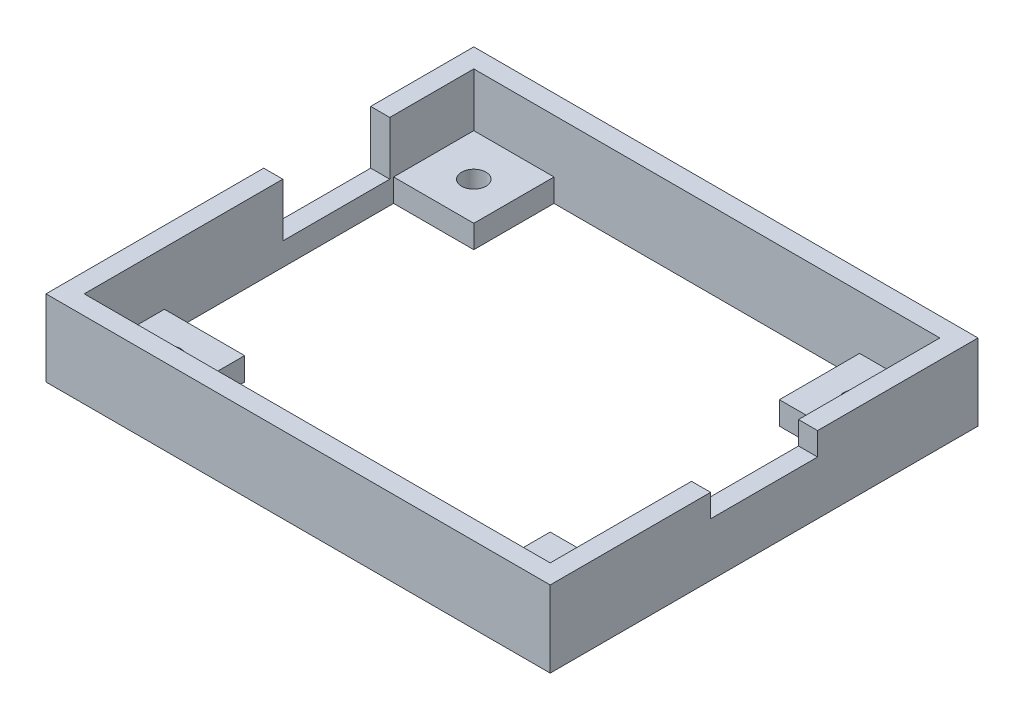
ISO-10303-21;
HEADER;
FILE_DESCRIPTION(('STEP AP214'),'2;1');
FILE_NAME('part.step','',(''),(''),'','','');
FILE_SCHEMA(('AUTOMOTIVE_DESIGN { 1 0 10303 214 1 1 1 1 }'));
ENDSEC;
DATA;
#1=APPLICATION_CONTEXT('core data for automotive mechanical design processes');
#2=APPLICATION_PROTOCOL_DEFINITION('international standard','automotive_design',2000,#1);
#3=PRODUCT_CONTEXT('',#1,'mechanical');
#4=PRODUCT('Part','Part','',(#3));
#5=PRODUCT_RELATED_PRODUCT_CATEGORY('part','',(#4));
#6=PRODUCT_DEFINITION_FORMATION('','',#4);
#7=PRODUCT_DEFINITION_CONTEXT('part definition',#1,'design');
#8=PRODUCT_DEFINITION('design','',#6,#7);
#9=PRODUCT_DEFINITION_SHAPE('','',#8);
#10=(LENGTH_UNIT() NAMED_UNIT(*) SI_UNIT(.MILLI.,.METRE.));
#11=(NAMED_UNIT(*) PLANE_ANGLE_UNIT() SI_UNIT($,.RADIAN.));
#12=(NAMED_UNIT(*) SI_UNIT($,.STERADIAN.) SOLID_ANGLE_UNIT());
#13=UNCERTAINTY_MEASURE_WITH_UNIT(LENGTH_MEASURE(1.E-05),#10,'distance_accuracy_value','');
#14=(GEOMETRIC_REPRESENTATION_CONTEXT(3) GLOBAL_UNCERTAINTY_ASSIGNED_CONTEXT((#13)) GLOBAL_UNIT_ASSIGNED_CONTEXT((#10,
#11,#12)) REPRESENTATION_CONTEXT('',''));
#15=CARTESIAN_POINT('',(0.,0.,0.));
#16=DIRECTION('',(0.,0.,1.));
#17=DIRECTION('',(1.,0.,0.));
#18=AXIS2_PLACEMENT_3D('',#15,#16,#17);
#19=CARTESIAN_POINT('',(0.,10.,0.));
#20=DIRECTION('',(0.,1.,0.));
#21=DIRECTION('',(0.,0.,1.));
#22=AXIS2_PLACEMENT_3D('',#19,#20,#21);
#23=PLANE('',#22);
#24=DIRECTION('',(1.,0.,0.));
#25=VECTOR('',#24,1.);
#26=CARTESIAN_POINT('',(23.,10.,7.));
#27=LINE('',#26,#25);
#28=CARTESIAN_POINT('',(30.5,10.,7.));
#29=VERTEX_POINT('',#28);
#30=CARTESIAN_POINT('',(33.,10.,7.));
#31=VERTEX_POINT('',#30);
#32=EDGE_CURVE('E234',#29,#31,#27,.T.);
#33=ORIENTED_EDGE('',*,*,#32,.F.);
#34=DIRECTION('',(0.,0.,-1.));
#35=VECTOR('',#34,1.);
#36=CARTESIAN_POINT('',(30.5,10.,25.5));
#37=LINE('',#36,#35);
#38=CARTESIAN_POINT('',(30.5,10.,25.5));
#39=VERTEX_POINT('',#38);
#40=EDGE_CURVE('E390',#39,#29,#37,.T.);
#41=ORIENTED_EDGE('',*,*,#40,.F.);
#42=DIRECTION('',(1.,0.,0.));
#43=VECTOR('',#42,1.);
#44=CARTESIAN_POINT('',(30.5,10.,25.5));
#45=LINE('',#44,#43);
#46=CARTESIAN_POINT('',(-30.5,10.,25.5));
#47=VERTEX_POINT('',#46);
#48=EDGE_CURVE('E386',#47,#39,#45,.T.);
#49=ORIENTED_EDGE('',*,*,#48,.F.);
#50=DIRECTION('',(0.,0.,1.));
#51=VECTOR('',#50,1.);
#52=CARTESIAN_POINT('',(-30.5,10.,25.5));
#53=LINE('',#52,#51);
#54=CARTESIAN_POINT('',(-30.5,10.,-0.499999999999997));
#55=VERTEX_POINT('',#54);
#56=EDGE_CURVE('E363',#55,#47,#53,.T.);
#57=ORIENTED_EDGE('',*,*,#56,.F.);
#58=DIRECTION('',(1.,0.,0.));
#59=VECTOR('',#58,1.);
#60=CARTESIAN_POINT('',(-40.5,10.,-0.499999999999997));
#61=LINE('',#60,#59);
#62=CARTESIAN_POINT('',(-33.,10.,-0.499999999999997));
#63=VERTEX_POINT('',#62);
#64=EDGE_CURVE('E259',#63,#55,#61,.T.);
#65=ORIENTED_EDGE('',*,*,#64,.F.);
#66=DIRECTION('',(0.,0.,1.));
#67=VECTOR('',#66,1.);
#68=CARTESIAN_POINT('',(-33.,10.,28.));
#69=LINE('',#68,#67);
#70=CARTESIAN_POINT('',(-33.,10.,28.));
#71=VERTEX_POINT('',#70);
#72=EDGE_CURVE('E410',#63,#71,#69,.T.);
#73=ORIENTED_EDGE('',*,*,#72,.T.);
#74=DIRECTION('',(1.,0.,0.));
#75=VECTOR('',#74,1.);
#76=CARTESIAN_POINT('',(33.,10.,28.));
#77=LINE('',#76,#75);
#78=CARTESIAN_POINT('',(33.,10.,28.));
#79=VERTEX_POINT('',#78);
#80=EDGE_CURVE('E409',#71,#79,#77,.T.);
#81=ORIENTED_EDGE('',*,*,#80,.T.);
#82=DIRECTION('',(0.,0.,-1.));
#83=VECTOR('',#82,1.);
#84=CARTESIAN_POINT('',(33.,10.,28.));
#85=LINE('',#84,#83);
#86=EDGE_CURVE('E413',#79,#31,#85,.T.);
#87=ORIENTED_EDGE('',*,*,#86,.T.);
#88=EDGE_LOOP('',(#33,#41,#49,#57,#65,#73,#81,#87));
#89=FACE_BOUND('',#88,.T.);
#90=ADVANCED_FACE('F35',(#89),#23,.T.);
#91=CARTESIAN_POINT('',(-33.,10.,28.));
#92=DIRECTION('',(1.,0.,0.));
#93=DIRECTION('',(0.,0.,-1.));
#94=AXIS2_PLACEMENT_3D('',#91,#92,#93);
#95=PLANE('',#94);
#96=DIRECTION('',(0.,1.,0.));
#97=VECTOR('',#96,1.);
#98=CARTESIAN_POINT('',(-33.,10.,-0.499999999999997));
#99=LINE('',#98,#97);
#100=CARTESIAN_POINT('',(-33.,3.,-0.499999999999997));
#101=VERTEX_POINT('',#100);
#102=EDGE_CURVE('E267',#101,#63,#99,.T.);
#103=ORIENTED_EDGE('',*,*,#102,.F.);
#104=DIRECTION('',(0.,0.,-1.));
#105=VECTOR('',#104,1.);
#106=CARTESIAN_POINT('',(-33.,3.,28.));
#107=LINE('',#106,#105);
#108=CARTESIAN_POINT('',(-33.,3.,-14.5));
#109=VERTEX_POINT('',#108);
#110=EDGE_CURVE('E269',#101,#109,#107,.T.);
#111=ORIENTED_EDGE('',*,*,#110,.T.);
#112=DIRECTION('',(0.,1.,0.));
#113=VECTOR('',#112,1.);
#114=CARTESIAN_POINT('',(-33.,10.,-14.5));
#115=LINE('',#114,#113);
#116=CARTESIAN_POINT('',(-33.,10.,-14.5));
#117=VERTEX_POINT('',#116);
#118=EDGE_CURVE('E258',#109,#117,#115,.T.);
#119=ORIENTED_EDGE('',*,*,#118,.T.);
#120=CARTESIAN_POINT('',(-33.,10.,-28.));
#121=VERTEX_POINT('',#120);
#122=EDGE_CURVE('E406',#121,#117,#69,.T.);
#123=ORIENTED_EDGE('',*,*,#122,.F.);
#124=DIRECTION('',(0.,-1.,0.));
#125=VECTOR('',#124,1.);
#126=CARTESIAN_POINT('',(-33.,10.,-28.));
#127=LINE('',#126,#125);
#128=CARTESIAN_POINT('',(-33.,0.,-28.));
#129=VERTEX_POINT('',#128);
#130=EDGE_CURVE('E417',#121,#129,#127,.T.);
#131=ORIENTED_EDGE('',*,*,#130,.T.);
#132=DIRECTION('',(0.,0.,1.));
#133=VECTOR('',#132,1.);
#134=CARTESIAN_POINT('',(-33.,0.,28.));
#135=LINE('',#134,#133);
#136=CARTESIAN_POINT('',(-33.,0.,28.));
#137=VERTEX_POINT('',#136);
#138=EDGE_CURVE('E398',#129,#137,#135,.T.);
#139=ORIENTED_EDGE('',*,*,#138,.T.);
#140=DIRECTION('',(0.,-1.,0.));
#141=VECTOR('',#140,1.);
#142=CARTESIAN_POINT('',(-33.,10.,28.));
#143=LINE('',#142,#141);
#144=EDGE_CURVE('E434',#71,#137,#143,.T.);
#145=ORIENTED_EDGE('',*,*,#144,.F.);
#146=ORIENTED_EDGE('',*,*,#72,.F.);
#147=EDGE_LOOP('',(#103,#111,#119,#123,#131,#139,#145,#146));
#148=FACE_BOUND('',#147,.T.);
#149=ADVANCED_FACE('F512',(#148),#95,.F.);
#150=DIRECTION('',(1.,0.,0.));
#151=VECTOR('',#150,1.);
#152=CARTESIAN_POINT('',(23.,10.,-7.));
#153=LINE('',#152,#151);
#154=CARTESIAN_POINT('',(30.5,10.,-7.));
#155=VERTEX_POINT('',#154);
#156=CARTESIAN_POINT('',(33.,10.,-7.));
#157=VERTEX_POINT('',#156);
#158=EDGE_CURVE('E245',#155,#157,#153,.T.);
#159=ORIENTED_EDGE('',*,*,#158,.T.);
#160=CARTESIAN_POINT('',(33.,10.,-28.));
#161=VERTEX_POINT('',#160);
#162=EDGE_CURVE('E412',#157,#161,#85,.T.);
#163=ORIENTED_EDGE('',*,*,#162,.T.);
#164=DIRECTION('',(-1.,0.,0.));
#165=VECTOR('',#164,1.);
#166=CARTESIAN_POINT('',(33.,10.,-28.));
#167=LINE('',#166,#165);
#168=EDGE_CURVE('E415',#161,#121,#167,.T.);
#169=ORIENTED_EDGE('',*,*,#168,.T.);
#170=ORIENTED_EDGE('',*,*,#122,.T.);
#171=DIRECTION('',(1.,0.,0.));
#172=VECTOR('',#171,1.);
#173=CARTESIAN_POINT('',(-40.5,10.,-14.5));
#174=LINE('',#173,#172);
#175=CARTESIAN_POINT('',(-30.5,10.,-14.5));
#176=VERTEX_POINT('',#175);
#177=EDGE_CURVE('E261',#117,#176,#174,.T.);
#178=ORIENTED_EDGE('',*,*,#177,.T.);
#179=CARTESIAN_POINT('',(-30.5,10.,-25.5));
#180=VERTEX_POINT('',#179);
#181=EDGE_CURVE('E383',#180,#176,#53,.T.);
#182=ORIENTED_EDGE('',*,*,#181,.F.);
#183=DIRECTION('',(-1.,0.,0.));
#184=VECTOR('',#183,1.);
#185=CARTESIAN_POINT('',(30.5,10.,-25.5));
#186=LINE('',#185,#184);
#187=CARTESIAN_POINT('',(30.5,10.,-25.5));
#188=VERTEX_POINT('',#187);
#189=EDGE_CURVE('E393',#188,#180,#186,.T.);
#190=ORIENTED_EDGE('',*,*,#189,.F.);
#191=EDGE_CURVE('E389',#155,#188,#37,.T.);
#192=ORIENTED_EDGE('',*,*,#191,.F.);
#193=EDGE_LOOP('',(#159,#163,#169,#170,#178,#182,#190,#192));
#194=FACE_BOUND('',#193,.T.);
#195=ADVANCED_FACE('F457',(#194),#23,.T.);
#196=CARTESIAN_POINT('',(-30.5,3.,25.5));
#197=DIRECTION('',(-1.,0.,0.));
#198=DIRECTION('',(0.,0.,1.));
#199=AXIS2_PLACEMENT_3D('',#196,#197,#198);
#200=PLANE('',#199);
#201=DIRECTION('',(0.,1.,0.));
#202=VECTOR('',#201,1.);
#203=CARTESIAN_POINT('',(-30.5,3.,-0.499999999999997));
#204=LINE('',#203,#202);
#205=CARTESIAN_POINT('',(-30.5,3.,-0.499999999999997));
#206=VERTEX_POINT('',#205);
#207=EDGE_CURVE('E252',#206,#55,#204,.T.);
#208=ORIENTED_EDGE('',*,*,#207,.T.);
#209=ORIENTED_EDGE('',*,*,#56,.T.);
#210=DIRECTION('',(0.,1.,0.));
#211=VECTOR('',#210,1.);
#212=CARTESIAN_POINT('',(-30.5,3.,25.5));
#213=LINE('',#212,#211);
#214=CARTESIAN_POINT('',(-30.5,3.,25.5));
#215=VERTEX_POINT('',#214);
#216=EDGE_CURVE('E382',#215,#47,#213,.T.);
#217=ORIENTED_EDGE('',*,*,#216,.F.);
#218=DIRECTION('',(0.,0.,1.));
#219=VECTOR('',#218,1.);
#220=CARTESIAN_POINT('',(-30.5,3.,25.5));
#221=LINE('',#220,#219);
#222=CARTESIAN_POINT('',(-30.5,3.,15.));
#223=VERTEX_POINT('',#222);
#224=EDGE_CURVE('E370',#223,#215,#221,.T.);
#225=ORIENTED_EDGE('',*,*,#224,.F.);
#226=DIRECTION('',(0.,1.,0.));
#227=VECTOR('',#226,1.);
#228=CARTESIAN_POINT('',(-30.5,0.,15.));
#229=LINE('',#228,#227);
#230=CARTESIAN_POINT('',(-30.5,0.,15.));
#231=VERTEX_POINT('',#230);
#232=EDGE_CURVE('E348',#231,#223,#229,.T.);
#233=ORIENTED_EDGE('',*,*,#232,.F.);
#234=DIRECTION('',(0.,0.,1.));
#235=VECTOR('',#234,1.);
#236=CARTESIAN_POINT('',(-30.5,0.,0.));
#237=LINE('',#236,#235);
#238=CARTESIAN_POINT('',(-30.5,0.,-15.));
#239=VERTEX_POINT('',#238);
#240=EDGE_CURVE('E279',#239,#231,#237,.T.);
#241=ORIENTED_EDGE('',*,*,#240,.F.);
#242=DIRECTION('',(0.,1.,0.));
#243=VECTOR('',#242,1.);
#244=CARTESIAN_POINT('',(-30.5,0.,-15.));
#245=LINE('',#244,#243);
#246=CARTESIAN_POINT('',(-30.5,3.,-15.));
#247=VERTEX_POINT('',#246);
#248=EDGE_CURVE('E350',#239,#247,#245,.T.);
#249=ORIENTED_EDGE('',*,*,#248,.T.);
#250=CARTESIAN_POINT('',(-30.5,3.,-25.5));
#251=VERTEX_POINT('',#250);
#252=EDGE_CURVE('E366',#251,#247,#221,.T.);
#253=ORIENTED_EDGE('',*,*,#252,.F.);
#254=DIRECTION('',(0.,1.,0.));
#255=VECTOR('',#254,1.);
#256=CARTESIAN_POINT('',(-30.5,3.,-25.5));
#257=LINE('',#256,#255);
#258=EDGE_CURVE('E396',#251,#180,#257,.T.);
#259=ORIENTED_EDGE('',*,*,#258,.T.);
#260=ORIENTED_EDGE('',*,*,#181,.T.);
#261=DIRECTION('',(0.,1.,0.));
#262=VECTOR('',#261,1.);
#263=CARTESIAN_POINT('',(-30.5,3.,-14.5));
#264=LINE('',#263,#262);
#265=CARTESIAN_POINT('',(-30.5,3.,-14.5));
#266=VERTEX_POINT('',#265);
#267=EDGE_CURVE('E250',#266,#176,#264,.T.);
#268=ORIENTED_EDGE('',*,*,#267,.F.);
#269=DIRECTION('',(0.,0.,-1.));
#270=VECTOR('',#269,1.);
#271=CARTESIAN_POINT('',(-30.5,3.,-0.499999999999997));
#272=LINE('',#271,#270);
#273=EDGE_CURVE('E58',#206,#266,#272,.T.);
#274=ORIENTED_EDGE('',*,*,#273,.F.);
#275=EDGE_LOOP('',(#208,#209,#217,#225,#233,#241,#249,#253,#259,#260,#268,#274));
#276=FACE_BOUND('',#275,.T.);
#277=ADVANCED_FACE('F517',(#276),#200,.F.);
#278=CARTESIAN_POINT('',(0.,0.,0.));
#279=DIRECTION('',(0.,1.,0.));
#280=DIRECTION('',(0.,0.,1.));
#281=AXIS2_PLACEMENT_3D('',#278,#279,#280);
#282=PLANE('',#281);
#283=CARTESIAN_POINT('',(25.,0.,20.));
#284=DIRECTION('',(0.,1.,0.));
#285=DIRECTION('',(0.,0.,1.));
#286=AXIS2_PLACEMENT_3D('',#283,#284,#285);
#287=CIRCLE('',#286,1.6);
#288=CARTESIAN_POINT('',(25.,0.,21.6));
#289=VERTEX_POINT('',#288);
#290=EDGE_CURVE('E443',#289,#289,#287,.T.);
#291=ORIENTED_EDGE('',*,*,#290,.T.);
#292=EDGE_LOOP('',(#291));
#293=FACE_BOUND('',#292,.T.);
#294=CARTESIAN_POINT('',(-25.,0.,20.));
#295=DIRECTION('',(0.,1.,0.));
#296=DIRECTION('',(0.,0.,1.));
#297=AXIS2_PLACEMENT_3D('',#294,#295,#296);
#298=CIRCLE('',#297,1.6);
#299=CARTESIAN_POINT('',(-25.,0.,21.6));
#300=VERTEX_POINT('',#299);
#301=EDGE_CURVE('E437',#300,#300,#298,.T.);
#302=ORIENTED_EDGE('',*,*,#301,.T.);
#303=EDGE_LOOP('',(#302));
#304=FACE_BOUND('',#303,.T.);
#305=ORIENTED_EDGE('',*,*,#138,.F.);
#306=DIRECTION('',(-1.,0.,0.));
#307=VECTOR('',#306,1.);
#308=CARTESIAN_POINT('',(33.,0.,-28.));
#309=LINE('',#308,#307);
#310=CARTESIAN_POINT('',(33.,0.,-28.));
#311=VERTEX_POINT('',#310);
#312=EDGE_CURVE('E424',#311,#129,#309,.T.);
#313=ORIENTED_EDGE('',*,*,#312,.F.);
#314=DIRECTION('',(0.,0.,-1.));
#315=VECTOR('',#314,1.);
#316=CARTESIAN_POINT('',(33.,0.,28.));
#317=LINE('',#316,#315);
#318=CARTESIAN_POINT('',(33.,0.,28.));
#319=VERTEX_POINT('',#318);
#320=EDGE_CURVE('E422',#319,#311,#317,.T.);
#321=ORIENTED_EDGE('',*,*,#320,.F.);
#322=DIRECTION('',(1.,0.,0.));
#323=VECTOR('',#322,1.);
#324=CARTESIAN_POINT('',(33.,0.,28.));
#325=LINE('',#324,#323);
#326=EDGE_CURVE('E420',#137,#319,#325,.T.);
#327=ORIENTED_EDGE('',*,*,#326,.F.);
#328=EDGE_LOOP('',(#305,#313,#321,#327));
#329=FACE_BOUND('',#328,.T.);
#330=CARTESIAN_POINT('',(-25.,0.,-20.));
#331=DIRECTION('',(0.,1.,0.));
#332=DIRECTION('',(0.,0.,1.));
#333=AXIS2_PLACEMENT_3D('',#330,#331,#332);
#334=CIRCLE('',#333,1.6);
#335=CARTESIAN_POINT('',(-25.,0.,-18.4));
#336=VERTEX_POINT('',#335);
#337=EDGE_CURVE('E360',#336,#336,#334,.T.);
#338=ORIENTED_EDGE('',*,*,#337,.T.);
#339=EDGE_LOOP('',(#338));
#340=FACE_BOUND('',#339,.T.);
#341=CARTESIAN_POINT('',(25.,0.,-20.));
#342=DIRECTION('',(0.,1.,0.));
#343=DIRECTION('',(0.,0.,1.));
#344=AXIS2_PLACEMENT_3D('',#341,#342,#343);
#345=CIRCLE('',#344,1.6);
#346=CARTESIAN_POINT('',(25.,0.,-18.4));
#347=VERTEX_POINT('',#346);
#348=EDGE_CURVE('E331',#347,#347,#345,.T.);
#349=ORIENTED_EDGE('',*,*,#348,.T.);
#350=EDGE_LOOP('',(#349));
#351=FACE_BOUND('',#350,.T.);
#352=DIRECTION('',(0.,0.,-1.));
#353=VECTOR('',#352,1.);
#354=CARTESIAN_POINT('',(-20.,0.,0.));
#355=LINE('',#354,#353);
#356=CARTESIAN_POINT('',(-20.,0.,-15.));
#357=VERTEX_POINT('',#356);
#358=CARTESIAN_POINT('',(-20.,0.,-25.5));
#359=VERTEX_POINT('',#358);
#360=EDGE_CURVE('E273',#357,#359,#355,.T.);
#361=ORIENTED_EDGE('',*,*,#360,.F.);
#362=DIRECTION('',(-1.,0.,0.));
#363=VECTOR('',#362,1.);
#364=CARTESIAN_POINT('',(0.,0.,-15.));
#365=LINE('',#364,#363);
#366=EDGE_CURVE('E275',#357,#239,#365,.T.);
#367=ORIENTED_EDGE('',*,*,#366,.T.);
#368=ORIENTED_EDGE('',*,*,#240,.T.);
#369=DIRECTION('',(-1.,0.,0.));
#370=VECTOR('',#369,1.);
#371=CARTESIAN_POINT('',(0.,0.,15.));
#372=LINE('',#371,#370);
#373=CARTESIAN_POINT('',(-20.,0.,15.));
#374=VERTEX_POINT('',#373);
#375=EDGE_CURVE('E282',#374,#231,#372,.T.);
#376=ORIENTED_EDGE('',*,*,#375,.F.);
#377=DIRECTION('',(0.,0.,-1.));
#378=VECTOR('',#377,1.);
#379=CARTESIAN_POINT('',(-20.,0.,0.));
#380=LINE('',#379,#378);
#381=CARTESIAN_POINT('',(-20.,0.,25.5));
#382=VERTEX_POINT('',#381);
#383=EDGE_CURVE('E284',#382,#374,#380,.T.);
#384=ORIENTED_EDGE('',*,*,#383,.F.);
#385=DIRECTION('',(1.,0.,0.));
#386=VECTOR('',#385,1.);
#387=CARTESIAN_POINT('',(0.,0.,25.5));
#388=LINE('',#387,#386);
#389=CARTESIAN_POINT('',(20.,0.,25.5));
#390=VERTEX_POINT('',#389);
#391=EDGE_CURVE('E286',#382,#390,#388,.T.);
#392=ORIENTED_EDGE('',*,*,#391,.T.);
#393=DIRECTION('',(0.,0.,-1.));
#394=VECTOR('',#393,1.);
#395=CARTESIAN_POINT('',(20.,0.,0.));
#396=LINE('',#395,#394);
#397=CARTESIAN_POINT('',(20.,0.,15.));
#398=VERTEX_POINT('',#397);
#399=EDGE_CURVE('E289',#390,#398,#396,.T.);
#400=ORIENTED_EDGE('',*,*,#399,.T.);
#401=DIRECTION('',(-1.,0.,0.));
#402=VECTOR('',#401,1.);
#403=CARTESIAN_POINT('',(0.,0.,15.));
#404=LINE('',#403,#402);
#405=CARTESIAN_POINT('',(30.5,0.,15.));
#406=VERTEX_POINT('',#405);
#407=EDGE_CURVE('E292',#406,#398,#404,.T.);
#408=ORIENTED_EDGE('',*,*,#407,.F.);
#409=DIRECTION('',(0.,0.,-1.));
#410=VECTOR('',#409,1.);
#411=CARTESIAN_POINT('',(30.5,0.,0.));
#412=LINE('',#411,#410);
#413=CARTESIAN_POINT('',(30.5,0.,-15.));
#414=VERTEX_POINT('',#413);
#415=EDGE_CURVE('E294',#406,#414,#412,.T.);
#416=ORIENTED_EDGE('',*,*,#415,.T.);
#417=DIRECTION('',(-1.,0.,0.));
#418=VECTOR('',#417,1.);
#419=CARTESIAN_POINT('',(0.,0.,-15.));
#420=LINE('',#419,#418);
#421=CARTESIAN_POINT('',(20.,0.,-15.));
#422=VERTEX_POINT('',#421);
#423=EDGE_CURVE('E297',#414,#422,#420,.T.);
#424=ORIENTED_EDGE('',*,*,#423,.T.);
#425=DIRECTION('',(0.,0.,-1.));
#426=VECTOR('',#425,1.);
#427=CARTESIAN_POINT('',(20.,0.,0.));
#428=LINE('',#427,#426);
#429=CARTESIAN_POINT('',(20.,0.,-25.5));
#430=VERTEX_POINT('',#429);
#431=EDGE_CURVE('E300',#422,#430,#428,.T.);
#432=ORIENTED_EDGE('',*,*,#431,.T.);
#433=DIRECTION('',(-1.,0.,0.));
#434=VECTOR('',#433,1.);
#435=CARTESIAN_POINT('',(0.,0.,-25.5));
#436=LINE('',#435,#434);
#437=EDGE_CURVE('E303',#430,#359,#436,.T.);
#438=ORIENTED_EDGE('',*,*,#437,.T.);
#439=EDGE_LOOP('',(#361,#367,#368,#376,#384,#392,#400,#408,#416,#424,#432,#438));
#440=FACE_BOUND('',#439,.T.);
#441=ADVANCED_FACE('F479',(#293,#304,#329,#340,#351,#440),#282,.F.);
#442=CARTESIAN_POINT('',(0.,3.,0.));
#443=DIRECTION('',(0.,1.,0.));
#444=DIRECTION('',(0.,0.,1.));
#445=AXIS2_PLACEMENT_3D('',#442,#443,#444);
#446=PLANE('',#445);
#447=CARTESIAN_POINT('',(25.,3.,20.));
#448=DIRECTION('',(0.,1.,0.));
#449=DIRECTION('',(0.,0.,1.));
#450=AXIS2_PLACEMENT_3D('',#447,#448,#449);
#451=CIRCLE('',#450,1.6);
#452=CARTESIAN_POINT('',(25.,3.,21.6));
#453=VERTEX_POINT('',#452);
#454=EDGE_CURVE('E446',#453,#453,#451,.T.);
#455=ORIENTED_EDGE('',*,*,#454,.F.);
#456=EDGE_LOOP('',(#455));
#457=FACE_BOUND('',#456,.T.);
#458=DIRECTION('',(0.,0.,-1.));
#459=VECTOR('',#458,1.);
#460=CARTESIAN_POINT('',(30.5,3.,25.5));
#461=LINE('',#460,#459);
#462=CARTESIAN_POINT('',(30.5,3.,25.5));
#463=VERTEX_POINT('',#462);
#464=CARTESIAN_POINT('',(30.5,3.,15.));
#465=VERTEX_POINT('',#464);
#466=EDGE_CURVE('E375',#463,#465,#461,.T.);
#467=ORIENTED_EDGE('',*,*,#466,.T.);
#468=DIRECTION('',(-1.,0.,0.));
#469=VECTOR('',#468,1.);
#470=CARTESIAN_POINT('',(0.,3.,15.));
#471=LINE('',#470,#469);
#472=CARTESIAN_POINT('',(20.,3.,15.));
#473=VERTEX_POINT('',#472);
#474=EDGE_CURVE('E321',#465,#473,#471,.T.);
#475=ORIENTED_EDGE('',*,*,#474,.T.);
#476=DIRECTION('',(0.,0.,-1.));
#477=VECTOR('',#476,1.);
#478=CARTESIAN_POINT('',(20.,3.,0.));
#479=LINE('',#478,#477);
#480=CARTESIAN_POINT('',(20.,3.,25.5));
#481=VERTEX_POINT('',#480);
#482=EDGE_CURVE('E318',#481,#473,#479,.T.);
#483=ORIENTED_EDGE('',*,*,#482,.F.);
#484=DIRECTION('',(1.,0.,0.));
#485=VECTOR('',#484,1.);
#486=CARTESIAN_POINT('',(30.5,3.,25.5));
#487=LINE('',#486,#485);
#488=EDGE_CURVE('E369',#481,#463,#487,.T.);
#489=ORIENTED_EDGE('',*,*,#488,.T.);
#490=EDGE_LOOP('',(#467,#475,#483,#489));
#491=FACE_BOUND('',#490,.T.);
#492=ADVANCED_FACE('F487',(#457,#491),#446,.T.);
#493=CARTESIAN_POINT('',(-25.,3.,20.));
#494=DIRECTION('',(0.,1.,0.));
#495=DIRECTION('',(0.,0.,1.));
#496=AXIS2_PLACEMENT_3D('',#493,#494,#495);
#497=CIRCLE('',#496,1.6);
#498=CARTESIAN_POINT('',(-25.,3.,21.6));
#499=VERTEX_POINT('',#498);
#500=EDGE_CURVE('E440',#499,#499,#497,.T.);
#501=ORIENTED_EDGE('',*,*,#500,.F.);
#502=EDGE_LOOP('',(#501));
#503=FACE_BOUND('',#502,.T.);
#504=CARTESIAN_POINT('',(-20.,3.,25.5));
#505=VERTEX_POINT('',#504);
#506=EDGE_CURVE('E371',#215,#505,#487,.T.);
#507=ORIENTED_EDGE('',*,*,#506,.T.);
#508=DIRECTION('',(0.,0.,-1.));
#509=VECTOR('',#508,1.);
#510=CARTESIAN_POINT('',(-20.,3.,0.));
#511=LINE('',#510,#509);
#512=CARTESIAN_POINT('',(-20.,3.,15.));
#513=VERTEX_POINT('',#512);
#514=EDGE_CURVE('E315',#505,#513,#511,.T.);
#515=ORIENTED_EDGE('',*,*,#514,.T.);
#516=DIRECTION('',(-1.,0.,0.));
#517=VECTOR('',#516,1.);
#518=CARTESIAN_POINT('',(0.,3.,15.));
#519=LINE('',#518,#517);
#520=EDGE_CURVE('E312',#513,#223,#519,.T.);
#521=ORIENTED_EDGE('',*,*,#520,.T.);
#522=ORIENTED_EDGE('',*,*,#224,.T.);
#523=EDGE_LOOP('',(#507,#515,#521,#522));
#524=FACE_BOUND('',#523,.T.);
#525=ADVANCED_FACE('F761',(#503,#524),#446,.T.);
#526=CARTESIAN_POINT('',(-25.,3.,-20.));
#527=DIRECTION('',(0.,1.,0.));
#528=DIRECTION('',(0.,0.,1.));
#529=AXIS2_PLACEMENT_3D('',#526,#527,#528);
#530=CIRCLE('',#529,1.6);
#531=CARTESIAN_POINT('',(-25.,3.,-18.4));
#532=VERTEX_POINT('',#531);
#533=EDGE_CURVE('E359',#532,#532,#530,.T.);
#534=ORIENTED_EDGE('',*,*,#533,.F.);
#535=EDGE_LOOP('',(#534));
#536=FACE_BOUND('',#535,.T.);
#537=DIRECTION('',(-1.,0.,0.));
#538=VECTOR('',#537,1.);
#539=CARTESIAN_POINT('',(0.,3.,-15.));
#540=LINE('',#539,#538);
#541=CARTESIAN_POINT('',(-20.,3.,-15.));
#542=VERTEX_POINT('',#541);
#543=EDGE_CURVE('E309',#542,#247,#540,.T.);
#544=ORIENTED_EDGE('',*,*,#543,.F.);
#545=DIRECTION('',(0.,0.,-1.));
#546=VECTOR('',#545,1.);
#547=CARTESIAN_POINT('',(-20.,3.,0.));
#548=LINE('',#547,#546);
#549=CARTESIAN_POINT('',(-20.,3.,-25.5));
#550=VERTEX_POINT('',#549);
#551=EDGE_CURVE('E272',#542,#550,#548,.T.);
#552=ORIENTED_EDGE('',*,*,#551,.T.);
#553=DIRECTION('',(-1.,0.,0.));
#554=VECTOR('',#553,1.);
#555=CARTESIAN_POINT('',(30.5,3.,-25.5));
#556=LINE('',#555,#554);
#557=EDGE_CURVE('E378',#550,#251,#556,.T.);
#558=ORIENTED_EDGE('',*,*,#557,.T.);
#559=ORIENTED_EDGE('',*,*,#252,.T.);
#560=EDGE_LOOP('',(#544,#552,#558,#559));
#561=FACE_BOUND('',#560,.T.);
#562=ADVANCED_FACE('F521',(#536,#561),#446,.T.);
#563=CARTESIAN_POINT('',(25.,0.,20.));
#564=DIRECTION('',(0.,1.,0.));
#565=DIRECTION('',(0.,0.,1.));
#566=AXIS2_PLACEMENT_3D('',#563,#564,#565);
#567=CYLINDRICAL_SURFACE('',#566,1.6);
#568=ORIENTED_EDGE('',*,*,#290,.F.);
#569=EDGE_LOOP('',(#568));
#570=FACE_BOUND('',#569,.T.);
#571=ORIENTED_EDGE('',*,*,#454,.T.);
#572=EDGE_LOOP('',(#571));
#573=FACE_BOUND('',#572,.T.);
#574=ADVANCED_FACE('F37',(#570,#573),#567,.F.);
#575=CARTESIAN_POINT('',(-25.,0.,20.));
#576=DIRECTION('',(0.,1.,0.));
#577=DIRECTION('',(0.,0.,1.));
#578=AXIS2_PLACEMENT_3D('',#575,#576,#577);
#579=CYLINDRICAL_SURFACE('',#578,1.6);
#580=ORIENTED_EDGE('',*,*,#301,.F.);
#581=EDGE_LOOP('',(#580));
#582=FACE_BOUND('',#581,.T.);
#583=ORIENTED_EDGE('',*,*,#500,.T.);
#584=EDGE_LOOP('',(#583));
#585=FACE_BOUND('',#584,.T.);
#586=ADVANCED_FACE('F747',(#582,#585),#579,.F.);
#587=CARTESIAN_POINT('',(33.,10.,28.));
#588=DIRECTION('',(0.,0.,-1.));
#589=DIRECTION('',(-1.,0.,0.));
#590=AXIS2_PLACEMENT_3D('',#587,#588,#589);
#591=PLANE('',#590);
#592=ORIENTED_EDGE('',*,*,#326,.T.);
#593=DIRECTION('',(0.,-1.,0.));
#594=VECTOR('',#593,1.);
#595=CARTESIAN_POINT('',(33.,10.,28.));
#596=LINE('',#595,#594);
#597=EDGE_CURVE('E431',#79,#319,#596,.T.);
#598=ORIENTED_EDGE('',*,*,#597,.F.);
#599=ORIENTED_EDGE('',*,*,#80,.F.);
#600=ORIENTED_EDGE('',*,*,#144,.T.);
#601=EDGE_LOOP('',(#592,#598,#599,#600));
#602=FACE_BOUND('',#601,.T.);
#603=ADVANCED_FACE('F786',(#602),#591,.F.);
#604=CARTESIAN_POINT('',(33.,10.,28.));
#605=DIRECTION('',(-1.,0.,0.));
#606=DIRECTION('',(0.,0.,1.));
#607=AXIS2_PLACEMENT_3D('',#604,#605,#606);
#608=PLANE('',#607);
#609=DIRECTION('',(0.,0.,-1.));
#610=VECTOR('',#609,1.);
#611=CARTESIAN_POINT('',(33.,7.,7.));
#612=LINE('',#611,#610);
#613=CARTESIAN_POINT('',(33.,7.,7.));
#614=VERTEX_POINT('',#613);
#615=CARTESIAN_POINT('',(33.,7.,-7.));
#616=VERTEX_POINT('',#615);
#617=EDGE_CURVE('E223',#614,#616,#612,.T.);
#618=ORIENTED_EDGE('',*,*,#617,.F.);
#619=DIRECTION('',(0.,-1.,0.));
#620=VECTOR('',#619,1.);
#621=CARTESIAN_POINT('',(33.,10.,7.));
#622=LINE('',#621,#620);
#623=EDGE_CURVE('E231',#31,#614,#622,.T.);
#624=ORIENTED_EDGE('',*,*,#623,.F.);
#625=ORIENTED_EDGE('',*,*,#86,.F.);
#626=ORIENTED_EDGE('',*,*,#597,.T.);
#627=ORIENTED_EDGE('',*,*,#320,.T.);
#628=DIRECTION('',(0.,-1.,0.));
#629=VECTOR('',#628,1.);
#630=CARTESIAN_POINT('',(33.,10.,-28.));
#631=LINE('',#630,#629);
#632=EDGE_CURVE('E428',#161,#311,#631,.T.);
#633=ORIENTED_EDGE('',*,*,#632,.F.);
#634=ORIENTED_EDGE('',*,*,#162,.F.);
#635=DIRECTION('',(0.,1.,0.));
#636=VECTOR('',#635,1.);
#637=CARTESIAN_POINT('',(33.,10.,-7.));
#638=LINE('',#637,#636);
#639=EDGE_CURVE('E228',#616,#157,#638,.T.);
#640=ORIENTED_EDGE('',*,*,#639,.F.);
#641=EDGE_LOOP('',(#618,#624,#625,#626,#627,#633,#634,#640));
#642=FACE_BOUND('',#641,.T.);
#643=ADVANCED_FACE('F239',(#642),#608,.F.);
#644=CARTESIAN_POINT('',(33.,10.,-28.));
#645=DIRECTION('',(0.,0.,1.));
#646=DIRECTION('',(1.,0.,0.));
#647=AXIS2_PLACEMENT_3D('',#644,#645,#646);
#648=PLANE('',#647);
#649=ORIENTED_EDGE('',*,*,#312,.T.);
#650=ORIENTED_EDGE('',*,*,#130,.F.);
#651=ORIENTED_EDGE('',*,*,#168,.F.);
#652=ORIENTED_EDGE('',*,*,#632,.T.);
#653=EDGE_LOOP('',(#649,#650,#651,#652));
#654=FACE_BOUND('',#653,.T.);
#655=ADVANCED_FACE('F507',(#654),#648,.F.);
#656=CARTESIAN_POINT('',(30.5,3.,-25.5));
#657=DIRECTION('',(0.,0.,-1.));
#658=DIRECTION('',(-1.,0.,0.));
#659=AXIS2_PLACEMENT_3D('',#656,#657,#658);
#660=PLANE('',#659);
#661=ORIENTED_EDGE('',*,*,#189,.T.);
#662=ORIENTED_EDGE('',*,*,#258,.F.);
#663=ORIENTED_EDGE('',*,*,#557,.F.);
#664=DIRECTION('',(0.,1.,0.));
#665=VECTOR('',#664,1.);
#666=CARTESIAN_POINT('',(-20.,0.,-25.5));
#667=LINE('',#666,#665);
#668=EDGE_CURVE('E329',#359,#550,#667,.T.);
#669=ORIENTED_EDGE('',*,*,#668,.F.);
#670=ORIENTED_EDGE('',*,*,#437,.F.);
#671=DIRECTION('',(0.,1.,0.));
#672=VECTOR('',#671,1.);
#673=CARTESIAN_POINT('',(20.,0.,-25.5));
#674=LINE('',#673,#672);
#675=CARTESIAN_POINT('',(20.,3.,-25.5));
#676=VERTEX_POINT('',#675);
#677=EDGE_CURVE('E332',#430,#676,#674,.T.);
#678=ORIENTED_EDGE('',*,*,#677,.T.);
#679=CARTESIAN_POINT('',(30.5,3.,-25.5));
#680=VERTEX_POINT('',#679);
#681=EDGE_CURVE('E379',#680,#676,#556,.T.);
#682=ORIENTED_EDGE('',*,*,#681,.F.);
#683=DIRECTION('',(0.,1.,0.));
#684=VECTOR('',#683,1.);
#685=CARTESIAN_POINT('',(30.5,3.,-25.5));
#686=LINE('',#685,#684);
#687=EDGE_CURVE('E399',#680,#188,#686,.T.);
#688=ORIENTED_EDGE('',*,*,#687,.T.);
#689=EDGE_LOOP('',(#661,#662,#663,#669,#670,#678,#682,#688));
#690=FACE_BOUND('',#689,.T.);
#691=ADVANCED_FACE('F461',(#690),#660,.F.);
#692=CARTESIAN_POINT('',(30.5,3.,25.5));
#693=DIRECTION('',(1.,0.,0.));
#694=DIRECTION('',(0.,0.,-1.));
#695=AXIS2_PLACEMENT_3D('',#692,#693,#694);
#696=PLANE('',#695);
#697=ORIENTED_EDGE('',*,*,#40,.T.);
#698=DIRECTION('',(0.,-1.,0.));
#699=VECTOR('',#698,1.);
#700=CARTESIAN_POINT('',(30.5,3.,7.));
#701=LINE('',#700,#699);
#702=CARTESIAN_POINT('',(30.5,7.,7.));
#703=VERTEX_POINT('',#702);
#704=EDGE_CURVE('E11',#29,#703,#701,.T.);
#705=ORIENTED_EDGE('',*,*,#704,.T.);
#706=DIRECTION('',(0.,0.,-1.));
#707=VECTOR('',#706,1.);
#708=CARTESIAN_POINT('',(30.5,7.,25.5));
#709=LINE('',#708,#707);
#710=CARTESIAN_POINT('',(30.5,7.,-7.));
#711=VERTEX_POINT('',#710);
#712=EDGE_CURVE('E226',#703,#711,#709,.T.);
#713=ORIENTED_EDGE('',*,*,#712,.T.);
#714=DIRECTION('',(0.,1.,0.));
#715=VECTOR('',#714,1.);
#716=CARTESIAN_POINT('',(30.5,2.99999999999998,-7.));
#717=LINE('',#716,#715);
#718=EDGE_CURVE('E43',#711,#155,#717,.T.);
#719=ORIENTED_EDGE('',*,*,#718,.T.);
#720=ORIENTED_EDGE('',*,*,#191,.T.);
#721=ORIENTED_EDGE('',*,*,#687,.F.);
#722=CARTESIAN_POINT('',(30.5,3.,-15.));
#723=VERTEX_POINT('',#722);
#724=EDGE_CURVE('E374',#723,#680,#461,.T.);
#725=ORIENTED_EDGE('',*,*,#724,.F.);
#726=DIRECTION('',(0.,1.,0.));
#727=VECTOR('',#726,1.);
#728=CARTESIAN_POINT('',(30.5,0.,-15.));
#729=LINE('',#728,#727);
#730=EDGE_CURVE('E336',#414,#723,#729,.T.);
#731=ORIENTED_EDGE('',*,*,#730,.F.);
#732=ORIENTED_EDGE('',*,*,#415,.F.);
#733=DIRECTION('',(0.,1.,0.));
#734=VECTOR('',#733,1.);
#735=CARTESIAN_POINT('',(30.5,0.,15.));
#736=LINE('',#735,#734);
#737=EDGE_CURVE('E338',#406,#465,#736,.T.);
#738=ORIENTED_EDGE('',*,*,#737,.T.);
#739=ORIENTED_EDGE('',*,*,#466,.F.);
#740=DIRECTION('',(0.,1.,0.));
#741=VECTOR('',#740,1.);
#742=CARTESIAN_POINT('',(30.5,3.,25.5));
#743=LINE('',#742,#741);
#744=EDGE_CURVE('E402',#463,#39,#743,.T.);
#745=ORIENTED_EDGE('',*,*,#744,.T.);
#746=EDGE_LOOP('',(#697,#705,#713,#719,#720,#721,#725,#731,#732,#738,#739,#745));
#747=FACE_BOUND('',#746,.T.);
#748=ADVANCED_FACE('F452',(#747),#696,.F.);
#749=CARTESIAN_POINT('',(30.5,3.,25.5));
#750=DIRECTION('',(0.,0.,1.));
#751=DIRECTION('',(1.,0.,0.));
#752=AXIS2_PLACEMENT_3D('',#749,#750,#751);
#753=PLANE('',#752);
#754=ORIENTED_EDGE('',*,*,#48,.T.);
#755=ORIENTED_EDGE('',*,*,#744,.F.);
#756=ORIENTED_EDGE('',*,*,#488,.F.);
#757=DIRECTION('',(0.,1.,0.));
#758=VECTOR('',#757,1.);
#759=CARTESIAN_POINT('',(20.,0.,25.5));
#760=LINE('',#759,#758);
#761=EDGE_CURVE('E342',#390,#481,#760,.T.);
#762=ORIENTED_EDGE('',*,*,#761,.F.);
#763=ORIENTED_EDGE('',*,*,#391,.F.);
#764=DIRECTION('',(0.,1.,0.));
#765=VECTOR('',#764,1.);
#766=CARTESIAN_POINT('',(-20.,0.,25.5));
#767=LINE('',#766,#765);
#768=EDGE_CURVE('E344',#382,#505,#767,.T.);
#769=ORIENTED_EDGE('',*,*,#768,.T.);
#770=ORIENTED_EDGE('',*,*,#506,.F.);
#771=ORIENTED_EDGE('',*,*,#216,.T.);
#772=EDGE_LOOP('',(#754,#755,#756,#762,#763,#769,#770,#771));
#773=FACE_BOUND('',#772,.T.);
#774=ADVANCED_FACE('F491',(#773),#753,.F.);
#775=DIRECTION('',(0.,0.,-1.));
#776=VECTOR('',#775,1.);
#777=CARTESIAN_POINT('',(20.,3.,0.));
#778=LINE('',#777,#776);
#779=CARTESIAN_POINT('',(20.,3.,-15.));
#780=VERTEX_POINT('',#779);
#781=EDGE_CURVE('E276',#780,#676,#778,.T.);
#782=ORIENTED_EDGE('',*,*,#781,.F.);
#783=DIRECTION('',(-1.,0.,0.));
#784=VECTOR('',#783,1.);
#785=CARTESIAN_POINT('',(0.,3.,-15.));
#786=LINE('',#785,#784);
#787=EDGE_CURVE('E324',#723,#780,#786,.T.);
#788=ORIENTED_EDGE('',*,*,#787,.F.);
#789=ORIENTED_EDGE('',*,*,#724,.T.);
#790=ORIENTED_EDGE('',*,*,#681,.T.);
#791=EDGE_LOOP('',(#782,#788,#789,#790));
#792=FACE_BOUND('',#791,.T.);
#793=CARTESIAN_POINT('',(25.,3.,-20.));
#794=DIRECTION('',(0.,1.,0.));
#795=DIRECTION('',(0.,0.,1.));
#796=AXIS2_PLACEMENT_3D('',#793,#794,#795);
#797=CIRCLE('',#796,1.6);
#798=CARTESIAN_POINT('',(25.,3.,-18.4));
#799=VERTEX_POINT('',#798);
#800=EDGE_CURVE('E356',#799,#799,#797,.T.);
#801=ORIENTED_EDGE('',*,*,#800,.F.);
#802=EDGE_LOOP('',(#801));
#803=FACE_BOUND('',#802,.T.);
#804=ADVANCED_FACE('F471',(#792,#803),#446,.T.);
#805=CARTESIAN_POINT('',(-25.,0.,-20.));
#806=DIRECTION('',(0.,1.,0.));
#807=DIRECTION('',(0.,0.,1.));
#808=AXIS2_PLACEMENT_3D('',#805,#806,#807);
#809=CYLINDRICAL_SURFACE('',#808,1.6);
#810=ORIENTED_EDGE('',*,*,#337,.F.);
#811=EDGE_LOOP('',(#810));
#812=FACE_BOUND('',#811,.T.);
#813=ORIENTED_EDGE('',*,*,#533,.T.);
#814=EDGE_LOOP('',(#813));
#815=FACE_BOUND('',#814,.T.);
#816=ADVANCED_FACE('F563',(#812,#815),#809,.F.);
#817=CARTESIAN_POINT('',(25.,0.,-20.));
#818=DIRECTION('',(0.,1.,0.));
#819=DIRECTION('',(0.,0.,1.));
#820=AXIS2_PLACEMENT_3D('',#817,#818,#819);
#821=CYLINDRICAL_SURFACE('',#820,1.6);
#822=ORIENTED_EDGE('',*,*,#348,.F.);
#823=EDGE_LOOP('',(#822));
#824=FACE_BOUND('',#823,.T.);
#825=ORIENTED_EDGE('',*,*,#800,.T.);
#826=EDGE_LOOP('',(#825));
#827=FACE_BOUND('',#826,.T.);
#828=ADVANCED_FACE('F535',(#824,#827),#821,.F.);
#829=CARTESIAN_POINT('',(-20.,0.,0.));
#830=DIRECTION('',(1.,0.,0.));
#831=DIRECTION('',(0.,0.,-1.));
#832=AXIS2_PLACEMENT_3D('',#829,#830,#831);
#833=PLANE('',#832);
#834=ORIENTED_EDGE('',*,*,#551,.F.);
#835=DIRECTION('',(0.,1.,0.));
#836=VECTOR('',#835,1.);
#837=CARTESIAN_POINT('',(-20.,0.,-15.));
#838=LINE('',#837,#836);
#839=EDGE_CURVE('E306',#357,#542,#838,.T.);
#840=ORIENTED_EDGE('',*,*,#839,.F.);
#841=ORIENTED_EDGE('',*,*,#360,.T.);
#842=ORIENTED_EDGE('',*,*,#668,.T.);
#843=EDGE_LOOP('',(#834,#840,#841,#842));
#844=FACE_BOUND('',#843,.T.);
#845=ADVANCED_FACE('F528',(#844),#833,.T.);
#846=CARTESIAN_POINT('',(20.,0.,0.));
#847=DIRECTION('',(1.,0.,0.));
#848=DIRECTION('',(0.,0.,-1.));
#849=AXIS2_PLACEMENT_3D('',#846,#847,#848);
#850=PLANE('',#849);
#851=ORIENTED_EDGE('',*,*,#781,.T.);
#852=ORIENTED_EDGE('',*,*,#677,.F.);
#853=ORIENTED_EDGE('',*,*,#431,.F.);
#854=DIRECTION('',(0.,1.,0.));
#855=VECTOR('',#854,1.);
#856=CARTESIAN_POINT('',(20.,0.,-15.));
#857=LINE('',#856,#855);
#858=EDGE_CURVE('E334',#422,#780,#857,.T.);
#859=ORIENTED_EDGE('',*,*,#858,.T.);
#860=EDGE_LOOP('',(#851,#852,#853,#859));
#861=FACE_BOUND('',#860,.T.);
#862=ADVANCED_FACE('F526',(#861),#850,.F.);
#863=CARTESIAN_POINT('',(0.,0.,-15.));
#864=DIRECTION('',(0.,0.,-1.));
#865=DIRECTION('',(-1.,0.,0.));
#866=AXIS2_PLACEMENT_3D('',#863,#864,#865);
#867=PLANE('',#866);
#868=ORIENTED_EDGE('',*,*,#787,.T.);
#869=ORIENTED_EDGE('',*,*,#858,.F.);
#870=ORIENTED_EDGE('',*,*,#423,.F.);
#871=ORIENTED_EDGE('',*,*,#730,.T.);
#872=EDGE_LOOP('',(#868,#869,#870,#871));
#873=FACE_BOUND('',#872,.T.);
#874=ADVANCED_FACE('F474',(#873),#867,.F.);
#875=CARTESIAN_POINT('',(0.,0.,15.));
#876=DIRECTION('',(0.,0.,-1.));
#877=DIRECTION('',(-1.,0.,0.));
#878=AXIS2_PLACEMENT_3D('',#875,#876,#877);
#879=PLANE('',#878);
#880=ORIENTED_EDGE('',*,*,#474,.F.);
#881=ORIENTED_EDGE('',*,*,#737,.F.);
#882=ORIENTED_EDGE('',*,*,#407,.T.);
#883=DIRECTION('',(0.,1.,0.));
#884=VECTOR('',#883,1.);
#885=CARTESIAN_POINT('',(20.,0.,15.));
#886=LINE('',#885,#884);
#887=EDGE_CURVE('E340',#398,#473,#886,.T.);
#888=ORIENTED_EDGE('',*,*,#887,.T.);
#889=EDGE_LOOP('',(#880,#881,#882,#888));
#890=FACE_BOUND('',#889,.T.);
#891=ADVANCED_FACE('F483',(#890),#879,.T.);
#892=CARTESIAN_POINT('',(20.,0.,0.));
#893=DIRECTION('',(1.,0.,0.));
#894=DIRECTION('',(0.,0.,-1.));
#895=AXIS2_PLACEMENT_3D('',#892,#893,#894);
#896=PLANE('',#895);
#897=ORIENTED_EDGE('',*,*,#482,.T.);
#898=ORIENTED_EDGE('',*,*,#887,.F.);
#899=ORIENTED_EDGE('',*,*,#399,.F.);
#900=ORIENTED_EDGE('',*,*,#761,.T.);
#901=EDGE_LOOP('',(#897,#898,#899,#900));
#902=FACE_BOUND('',#901,.T.);
#903=ADVANCED_FACE('F582',(#902),#896,.F.);
#904=CARTESIAN_POINT('',(-20.,0.,0.));
#905=DIRECTION('',(1.,0.,0.));
#906=DIRECTION('',(0.,0.,-1.));
#907=AXIS2_PLACEMENT_3D('',#904,#905,#906);
#908=PLANE('',#907);
#909=ORIENTED_EDGE('',*,*,#514,.F.);
#910=ORIENTED_EDGE('',*,*,#768,.F.);
#911=ORIENTED_EDGE('',*,*,#383,.T.);
#912=DIRECTION('',(0.,1.,0.));
#913=VECTOR('',#912,1.);
#914=CARTESIAN_POINT('',(-20.,0.,15.));
#915=LINE('',#914,#913);
#916=EDGE_CURVE('E346',#374,#513,#915,.T.);
#917=ORIENTED_EDGE('',*,*,#916,.T.);
#918=EDGE_LOOP('',(#909,#910,#911,#917));
#919=FACE_BOUND('',#918,.T.);
#920=ADVANCED_FACE('F578',(#919),#908,.T.);
#921=CARTESIAN_POINT('',(0.,0.,15.));
#922=DIRECTION('',(0.,0.,-1.));
#923=DIRECTION('',(-1.,0.,0.));
#924=AXIS2_PLACEMENT_3D('',#921,#922,#923);
#925=PLANE('',#924);
#926=ORIENTED_EDGE('',*,*,#520,.F.);
#927=ORIENTED_EDGE('',*,*,#916,.F.);
#928=ORIENTED_EDGE('',*,*,#375,.T.);
#929=ORIENTED_EDGE('',*,*,#232,.T.);
#930=EDGE_LOOP('',(#926,#927,#928,#929));
#931=FACE_BOUND('',#930,.T.);
#932=ADVANCED_FACE('F574',(#931),#925,.T.);
#933=CARTESIAN_POINT('',(0.,0.,-15.));
#934=DIRECTION('',(0.,0.,-1.));
#935=DIRECTION('',(-1.,0.,0.));
#936=AXIS2_PLACEMENT_3D('',#933,#934,#935);
#937=PLANE('',#936);
#938=ORIENTED_EDGE('',*,*,#543,.T.);
#939=ORIENTED_EDGE('',*,*,#248,.F.);
#940=ORIENTED_EDGE('',*,*,#366,.F.);
#941=ORIENTED_EDGE('',*,*,#839,.T.);
#942=EDGE_LOOP('',(#938,#939,#940,#941));
#943=FACE_BOUND('',#942,.T.);
#944=ADVANCED_FACE('F570',(#943),#937,.F.);
#945=CARTESIAN_POINT('',(-40.5,3.,-0.499999999999997));
#946=DIRECTION('',(0.,-1.,0.));
#947=DIRECTION('',(0.,0.,-1.));
#948=AXIS2_PLACEMENT_3D('',#945,#946,#947);
#949=PLANE('',#948);
#950=DIRECTION('',(1.,0.,0.));
#951=VECTOR('',#950,1.);
#952=CARTESIAN_POINT('',(-40.5,3.,-0.499999999999997));
#953=LINE('',#952,#951);
#954=EDGE_CURVE('E256',#101,#206,#953,.T.);
#955=ORIENTED_EDGE('',*,*,#954,.T.);
#956=ORIENTED_EDGE('',*,*,#273,.T.);
#957=DIRECTION('',(1.,0.,0.));
#958=VECTOR('',#957,1.);
#959=CARTESIAN_POINT('',(-40.5,3.,-14.5));
#960=LINE('',#959,#958);
#961=EDGE_CURVE('E255',#109,#266,#960,.T.);
#962=ORIENTED_EDGE('',*,*,#961,.F.);
#963=ORIENTED_EDGE('',*,*,#110,.F.);
#964=EDGE_LOOP('',(#955,#956,#962,#963));
#965=FACE_BOUND('',#964,.T.);
#966=ADVANCED_FACE('F573',(#965),#949,.F.);
#967=CARTESIAN_POINT('',(-40.5,3.,-0.499999999999997));
#968=DIRECTION('',(0.,0.,-1.));
#969=DIRECTION('',(-1.,0.,0.));
#970=AXIS2_PLACEMENT_3D('',#967,#968,#969);
#971=PLANE('',#970);
#972=ORIENTED_EDGE('',*,*,#102,.T.);
#973=ORIENTED_EDGE('',*,*,#64,.T.);
#974=ORIENTED_EDGE('',*,*,#207,.F.);
#975=ORIENTED_EDGE('',*,*,#954,.F.);
#976=EDGE_LOOP('',(#972,#973,#974,#975));
#977=FACE_BOUND('',#976,.T.);
#978=ADVANCED_FACE('F615',(#977),#971,.T.);
#979=CARTESIAN_POINT('',(-40.5,3.,-14.5));
#980=DIRECTION('',(0.,0.,-1.));
#981=DIRECTION('',(-1.,0.,0.));
#982=AXIS2_PLACEMENT_3D('',#979,#980,#981);
#983=PLANE('',#982);
#984=ORIENTED_EDGE('',*,*,#961,.T.);
#985=ORIENTED_EDGE('',*,*,#267,.T.);
#986=ORIENTED_EDGE('',*,*,#177,.F.);
#987=ORIENTED_EDGE('',*,*,#118,.F.);
#988=EDGE_LOOP('',(#984,#985,#986,#987));
#989=FACE_BOUND('',#988,.T.);
#990=ADVANCED_FACE('F621',(#989),#983,.F.);
#991=CARTESIAN_POINT('',(23.,10.,7.));
#992=DIRECTION('',(0.,0.,1.));
#993=DIRECTION('',(1.,0.,0.));
#994=AXIS2_PLACEMENT_3D('',#991,#992,#993);
#995=PLANE('',#994);
#996=ORIENTED_EDGE('',*,*,#32,.T.);
#997=ORIENTED_EDGE('',*,*,#623,.T.);
#998=DIRECTION('',(1.,0.,0.));
#999=VECTOR('',#998,1.);
#1000=CARTESIAN_POINT('',(23.,7.,7.));
#1001=LINE('',#1000,#999);
#1002=EDGE_CURVE('E219',#703,#614,#1001,.T.);
#1003=ORIENTED_EDGE('',*,*,#1002,.F.);
#1004=ORIENTED_EDGE('',*,*,#704,.F.);
#1005=EDGE_LOOP('',(#996,#997,#1003,#1004));
#1006=FACE_BOUND('',#1005,.T.);
#1007=ADVANCED_FACE('F232',(#1006),#995,.F.);
#1008=CARTESIAN_POINT('',(23.,10.,-7.));
#1009=DIRECTION('',(0.,0.,-1.));
#1010=DIRECTION('',(0.,1.,0.));
#1011=AXIS2_PLACEMENT_3D('',#1008,#1009,#1010);
#1012=PLANE('',#1011);
#1013=DIRECTION('',(1.,0.,0.));
#1014=VECTOR('',#1013,1.);
#1015=CARTESIAN_POINT('',(23.,7.,-7.));
#1016=LINE('',#1015,#1014);
#1017=EDGE_CURVE('E50',#711,#616,#1016,.T.);
#1018=ORIENTED_EDGE('',*,*,#1017,.T.);
#1019=ORIENTED_EDGE('',*,*,#639,.T.);
#1020=ORIENTED_EDGE('',*,*,#158,.F.);
#1021=ORIENTED_EDGE('',*,*,#718,.F.);
#1022=EDGE_LOOP('',(#1018,#1019,#1020,#1021));
#1023=FACE_BOUND('',#1022,.T.);
#1024=ADVANCED_FACE('F635',(#1023),#1012,.F.);
#1025=CARTESIAN_POINT('',(23.,7.,7.));
#1026=DIRECTION('',(0.,-1.,0.));
#1027=DIRECTION('',(0.,0.,-1.));
#1028=AXIS2_PLACEMENT_3D('',#1025,#1026,#1027);
#1029=PLANE('',#1028);
#1030=ORIENTED_EDGE('',*,*,#1002,.T.);
#1031=ORIENTED_EDGE('',*,*,#617,.T.);
#1032=ORIENTED_EDGE('',*,*,#1017,.F.);
#1033=ORIENTED_EDGE('',*,*,#712,.F.);
#1034=EDGE_LOOP('',(#1030,#1031,#1032,#1033));
#1035=FACE_BOUND('',#1034,.T.);
#1036=ADVANCED_FACE('F221',(#1035),#1029,.F.);
#1037=CLOSED_SHELL('',(#90,#149,#195,#277,#441,#492,#525,#562,#574,#586,#603,#643,#655,#691,
#748,#774,#804,#816,#828,#845,#862,#874,#891,#903,#920,#932,#944,#966,#978,#990,#1007,#1024,#1036));
#1038=MANIFOLD_SOLID_BREP('B2',#1037);
#1039=ADVANCED_BREP_SHAPE_REPRESENTATION('',(#18,#1038),#14);
#1040=SHAPE_DEFINITION_REPRESENTATION(#9,#1039);
ENDSEC;
END-ISO-10303-21;
